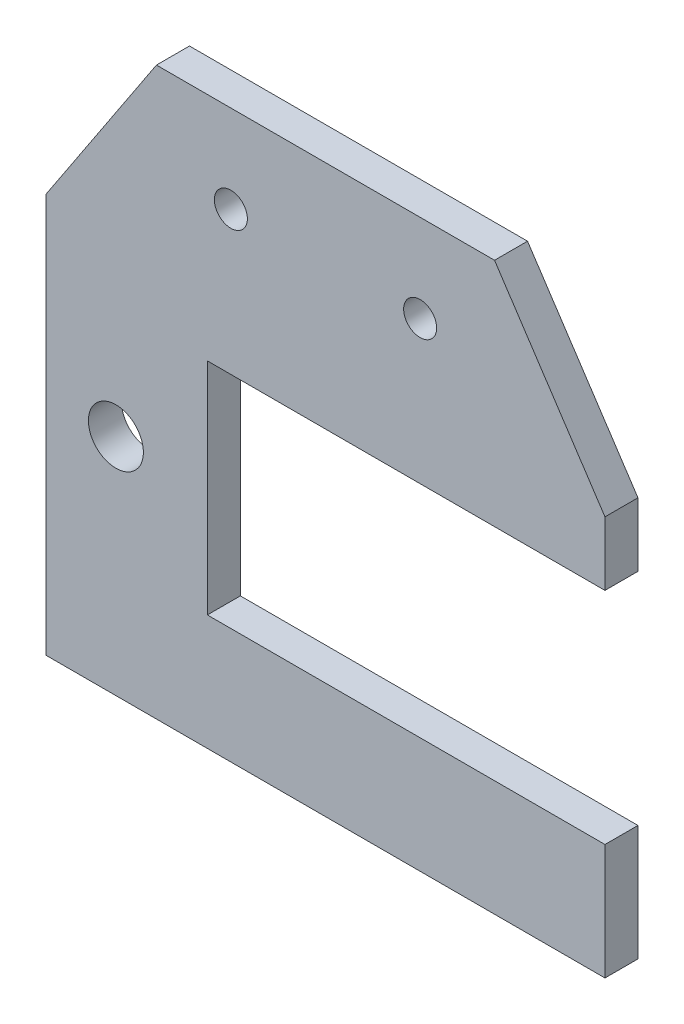
ISO-10303-21;
HEADER;
FILE_DESCRIPTION(('STEP AP214'),'2;1');
FILE_NAME('part.step','',(''),(''),'','','');
FILE_SCHEMA(('AUTOMOTIVE_DESIGN { 1 0 10303 214 1 1 1 1 }'));
ENDSEC;
DATA;
#1=APPLICATION_CONTEXT('core data for automotive mechanical design processes');
#2=APPLICATION_PROTOCOL_DEFINITION('international standard','automotive_design',2000,#1);
#3=PRODUCT_CONTEXT('',#1,'mechanical');
#4=PRODUCT('Part','Part','',(#3));
#5=PRODUCT_RELATED_PRODUCT_CATEGORY('part','',(#4));
#6=PRODUCT_DEFINITION_FORMATION('','',#4);
#7=PRODUCT_DEFINITION_CONTEXT('part definition',#1,'design');
#8=PRODUCT_DEFINITION('design','',#6,#7);
#9=PRODUCT_DEFINITION_SHAPE('','',#8);
#10=(LENGTH_UNIT() NAMED_UNIT(*) SI_UNIT(.MILLI.,.METRE.));
#11=(NAMED_UNIT(*) PLANE_ANGLE_UNIT() SI_UNIT($,.RADIAN.));
#12=(NAMED_UNIT(*) SI_UNIT($,.STERADIAN.) SOLID_ANGLE_UNIT());
#13=UNCERTAINTY_MEASURE_WITH_UNIT(LENGTH_MEASURE(1.E-05),#10,'distance_accuracy_value','');
#14=(GEOMETRIC_REPRESENTATION_CONTEXT(3) GLOBAL_UNCERTAINTY_ASSIGNED_CONTEXT((#13)) GLOBAL_UNIT_ASSIGNED_CONTEXT((#10,
#11,#12)) REPRESENTATION_CONTEXT('',''));
#15=CARTESIAN_POINT('',(0.,0.,0.));
#16=DIRECTION('',(0.,0.,1.));
#17=DIRECTION('',(1.,0.,0.));
#18=AXIS2_PLACEMENT_3D('',#15,#16,#17);
#19=CARTESIAN_POINT('',(0.,-1.81128409951094,3.));
#20=DIRECTION('',(0.,1.,0.));
#21=DIRECTION('',(-1.,0.,0.));
#22=AXIS2_PLACEMENT_3D('',#19,#20,#21);
#23=PLANE('',#22);
#24=DIRECTION('',(1.,0.,0.));
#25=VECTOR('',#24,1.);
#26=CARTESIAN_POINT('',(0.,-1.81128409951094,0.));
#27=LINE('',#26,#25);
#28=CARTESIAN_POINT('',(-10.7376947569757,-1.81128409951094,0.));
#29=VERTEX_POINT('',#28);
#30=CARTESIAN_POINT('',(25.4023052430243,-1.81128409951094,0.));
#31=VERTEX_POINT('',#30);
#32=EDGE_CURVE('E196',#29,#31,#27,.T.);
#33=ORIENTED_EDGE('',*,*,#32,.F.);
#34=DIRECTION('',(0.,0.,-1.));
#35=VECTOR('',#34,1.);
#36=CARTESIAN_POINT('',(-10.7376947569757,-1.81128409951094,3.));
#37=LINE('',#36,#35);
#38=CARTESIAN_POINT('',(-10.7376947569757,-1.81128409951094,3.));
#39=VERTEX_POINT('',#38);
#40=EDGE_CURVE('E11',#39,#29,#37,.T.);
#41=ORIENTED_EDGE('',*,*,#40,.F.);
#42=DIRECTION('',(1.,0.,0.));
#43=VECTOR('',#42,1.);
#44=CARTESIAN_POINT('',(0.,-1.81128409951094,3.));
#45=LINE('',#44,#43);
#46=CARTESIAN_POINT('',(25.4023052430243,-1.81128409951094,3.));
#47=VERTEX_POINT('',#46);
#48=EDGE_CURVE('E307',#39,#47,#45,.T.);
#49=ORIENTED_EDGE('',*,*,#48,.T.);
#50=DIRECTION('',(0.,0.,-1.));
#51=VECTOR('',#50,1.);
#52=CARTESIAN_POINT('',(25.4023052430243,-1.81128409951094,3.));
#53=LINE('',#52,#51);
#54=EDGE_CURVE('E61',#47,#31,#53,.T.);
#55=ORIENTED_EDGE('',*,*,#54,.T.);
#56=EDGE_LOOP('',(#33,#41,#49,#55));
#57=FACE_BOUND('',#56,.T.);
#58=ADVANCED_FACE('F43',(#57),#23,.T.);
#59=CARTESIAN_POINT('',(-10.7376947569757,0.,3.));
#60=DIRECTION('',(1.,0.,0.));
#61=DIRECTION('',(0.,1.,0.));
#62=AXIS2_PLACEMENT_3D('',#59,#60,#61);
#63=PLANE('',#62);
#64=DIRECTION('',(0.,-1.,0.));
#65=VECTOR('',#64,1.);
#66=CARTESIAN_POINT('',(-10.7376947569757,0.,0.));
#67=LINE('',#66,#65);
#68=CARTESIAN_POINT('',(-10.7376947569757,18.1887159004891,0.));
#69=VERTEX_POINT('',#68);
#70=EDGE_CURVE('E188',#69,#29,#67,.T.);
#71=ORIENTED_EDGE('',*,*,#70,.F.);
#72=DIRECTION('',(0.,0.,-1.));
#73=VECTOR('',#72,1.);
#74=CARTESIAN_POINT('',(-10.7376947569757,18.1887159004891,3.));
#75=LINE('',#74,#73);
#76=CARTESIAN_POINT('',(-10.7376947569757,18.1887159004891,3.));
#77=VERTEX_POINT('',#76);
#78=EDGE_CURVE('E53',#77,#69,#75,.T.);
#79=ORIENTED_EDGE('',*,*,#78,.F.);
#80=DIRECTION('',(0.,-1.,0.));
#81=VECTOR('',#80,1.);
#82=CARTESIAN_POINT('',(-10.7376947569757,0.,3.));
#83=LINE('',#82,#81);
#84=EDGE_CURVE('E312',#77,#39,#83,.T.);
#85=ORIENTED_EDGE('',*,*,#84,.T.);
#86=ORIENTED_EDGE('',*,*,#40,.T.);
#87=EDGE_LOOP('',(#71,#79,#85,#86));
#88=FACE_BOUND('',#87,.T.);
#89=ADVANCED_FACE('F194',(#88),#63,.T.);
#90=CARTESIAN_POINT('',(0.,18.1887159004891,3.));
#91=DIRECTION('',(0.,1.,0.));
#92=DIRECTION('',(-1.,0.,0.));
#93=AXIS2_PLACEMENT_3D('',#90,#91,#92);
#94=PLANE('',#93);
#95=DIRECTION('',(1.,0.,0.));
#96=VECTOR('',#95,1.);
#97=CARTESIAN_POINT('',(0.,18.1887159004891,0.));
#98=LINE('',#97,#96);
#99=CARTESIAN_POINT('',(25.4023052430243,18.1887159004891,0.));
#100=VERTEX_POINT('',#99);
#101=EDGE_CURVE('E177',#69,#100,#98,.T.);
#102=ORIENTED_EDGE('',*,*,#101,.T.);
#103=DIRECTION('',(0.,0.,-1.));
#104=VECTOR('',#103,1.);
#105=CARTESIAN_POINT('',(25.4023052430243,18.1887159004891,3.));
#106=LINE('',#105,#104);
#107=CARTESIAN_POINT('',(25.4023052430243,18.1887159004891,3.));
#108=VERTEX_POINT('',#107);
#109=EDGE_CURVE('E167',#108,#100,#106,.T.);
#110=ORIENTED_EDGE('',*,*,#109,.F.);
#111=DIRECTION('',(1.,0.,0.));
#112=VECTOR('',#111,1.);
#113=CARTESIAN_POINT('',(0.,18.1887159004891,3.));
#114=LINE('',#113,#112);
#115=EDGE_CURVE('E179',#77,#108,#114,.T.);
#116=ORIENTED_EDGE('',*,*,#115,.F.);
#117=ORIENTED_EDGE('',*,*,#78,.T.);
#118=EDGE_LOOP('',(#102,#110,#116,#117));
#119=FACE_BOUND('',#118,.T.);
#120=ADVANCED_FACE('F175',(#119),#94,.F.);
#121=CARTESIAN_POINT('',(25.4023052430243,0.,3.));
#122=DIRECTION('',(1.,0.,0.));
#123=DIRECTION('',(0.,1.,0.));
#124=AXIS2_PLACEMENT_3D('',#121,#122,#123);
#125=PLANE('',#124);
#126=DIRECTION('',(0.,-1.,0.));
#127=VECTOR('',#126,1.);
#128=CARTESIAN_POINT('',(25.4023052430243,0.,0.));
#129=LINE('',#128,#127);
#130=CARTESIAN_POINT('',(25.4023052430243,23.9787159004891,0.));
#131=VERTEX_POINT('',#130);
#132=EDGE_CURVE('E191',#131,#100,#129,.T.);
#133=ORIENTED_EDGE('',*,*,#132,.F.);
#134=DIRECTION('',(0.,0.,-1.));
#135=VECTOR('',#134,1.);
#136=CARTESIAN_POINT('',(25.4023052430243,23.9787159004891,3.));
#137=LINE('',#136,#135);
#138=CARTESIAN_POINT('',(25.4023052430243,23.9787159004891,3.));
#139=VERTEX_POINT('',#138);
#140=EDGE_CURVE('E164',#139,#131,#137,.T.);
#141=ORIENTED_EDGE('',*,*,#140,.F.);
#142=DIRECTION('',(0.,-1.,0.));
#143=VECTOR('',#142,1.);
#144=CARTESIAN_POINT('',(25.4023052430243,0.,3.));
#145=LINE('',#144,#143);
#146=EDGE_CURVE('E320',#139,#108,#145,.T.);
#147=ORIENTED_EDGE('',*,*,#146,.T.);
#148=ORIENTED_EDGE('',*,*,#109,.T.);
#149=EDGE_LOOP('',(#133,#141,#147,#148));
#150=FACE_BOUND('',#149,.T.);
#151=ADVANCED_FACE('F272',(#150),#125,.T.);
#152=CARTESIAN_POINT('',(28.7074792914118,18.9794572707475,3.));
#153=DIRECTION('',(0.834174701276416,0.551500288078259,0.));
#154=DIRECTION('',(-0.551500288078259,0.834174701276416,0.));
#155=AXIS2_PLACEMENT_3D('',#152,#153,#154);
#156=PLANE('',#155);
#157=DIRECTION('',(0.551500288078259,-0.834174701276416,0.));
#158=VECTOR('',#157,1.);
#159=CARTESIAN_POINT('',(28.7074792914118,18.9794572707475,0.));
#160=LINE('',#159,#158);
#161=CARTESIAN_POINT('',(15.365,39.1606954637198,0.));
#162=VERTEX_POINT('',#161);
#163=EDGE_CURVE('E206',#162,#131,#160,.T.);
#164=ORIENTED_EDGE('',*,*,#163,.F.);
#165=DIRECTION('',(0.,0.,-1.));
#166=VECTOR('',#165,1.);
#167=CARTESIAN_POINT('',(15.365,39.1606954637198,3.));
#168=LINE('',#167,#166);
#169=CARTESIAN_POINT('',(15.365,39.1606954637198,3.));
#170=VERTEX_POINT('',#169);
#171=EDGE_CURVE('E161',#170,#162,#168,.T.);
#172=ORIENTED_EDGE('',*,*,#171,.F.);
#173=DIRECTION('',(0.551500288078259,-0.834174701276416,0.));
#174=VECTOR('',#173,1.);
#175=CARTESIAN_POINT('',(28.7074792914118,18.9794572707475,3.));
#176=LINE('',#175,#174);
#177=EDGE_CURVE('E324',#170,#139,#176,.T.);
#178=ORIENTED_EDGE('',*,*,#177,.T.);
#179=ORIENTED_EDGE('',*,*,#140,.T.);
#180=EDGE_LOOP('',(#164,#172,#178,#179));
#181=FACE_BOUND('',#180,.T.);
#182=ADVANCED_FACE('F275',(#181),#156,.T.);
#183=CARTESIAN_POINT('',(0.,39.1606954637198,3.));
#184=DIRECTION('',(0.,-1.,0.));
#185=DIRECTION('',(0.,0.,-1.));
#186=AXIS2_PLACEMENT_3D('',#183,#184,#185);
#187=PLANE('',#186);
#188=DIRECTION('',(-1.,0.,0.));
#189=VECTOR('',#188,1.);
#190=CARTESIAN_POINT('',(0.,39.1606954637198,0.));
#191=LINE('',#190,#189);
#192=CARTESIAN_POINT('',(-15.365,39.1606954637198,0.));
#193=VERTEX_POINT('',#192);
#194=EDGE_CURVE('E209',#162,#193,#191,.T.);
#195=ORIENTED_EDGE('',*,*,#194,.T.);
#196=DIRECTION('',(0.,0.,-1.));
#197=VECTOR('',#196,1.);
#198=CARTESIAN_POINT('',(-15.365,39.1606954637198,3.));
#199=LINE('',#198,#197);
#200=CARTESIAN_POINT('',(-15.365,39.1606954637198,3.));
#201=VERTEX_POINT('',#200);
#202=EDGE_CURVE('E153',#201,#193,#199,.T.);
#203=ORIENTED_EDGE('',*,*,#202,.F.);
#204=DIRECTION('',(-1.,0.,0.));
#205=VECTOR('',#204,1.);
#206=CARTESIAN_POINT('',(0.,39.1606954637198,3.));
#207=LINE('',#206,#205);
#208=EDGE_CURVE('E328',#170,#201,#207,.T.);
#209=ORIENTED_EDGE('',*,*,#208,.F.);
#210=ORIENTED_EDGE('',*,*,#171,.T.);
#211=EDGE_LOOP('',(#195,#203,#209,#210));
#212=FACE_BOUND('',#211,.T.);
#213=ADVANCED_FACE('F279',(#212),#187,.F.);
#214=CARTESIAN_POINT('',(-28.7074792914118,18.9794572707475,3.));
#215=DIRECTION('',(0.834174701276416,-0.551500288078259,0.));
#216=DIRECTION('',(0.551500288078259,0.834174701276416,0.));
#217=AXIS2_PLACEMENT_3D('',#214,#215,#216);
#218=PLANE('',#217);
#219=DIRECTION('',(-0.551500288078259,-0.834174701276416,0.));
#220=VECTOR('',#219,1.);
#221=CARTESIAN_POINT('',(-28.7074792914118,18.9794572707475,0.));
#222=LINE('',#221,#220);
#223=CARTESIAN_POINT('',(-25.4023052430243,23.9787159004891,0.));
#224=VERTEX_POINT('',#223);
#225=EDGE_CURVE('E213',#193,#224,#222,.T.);
#226=ORIENTED_EDGE('',*,*,#225,.T.);
#227=DIRECTION('',(0.,0.,-1.));
#228=VECTOR('',#227,1.);
#229=CARTESIAN_POINT('',(-25.4023052430243,23.9787159004891,3.));
#230=LINE('',#229,#228);
#231=CARTESIAN_POINT('',(-25.4023052430243,23.9787159004891,3.));
#232=VERTEX_POINT('',#231);
#233=EDGE_CURVE('E148',#232,#224,#230,.T.);
#234=ORIENTED_EDGE('',*,*,#233,.F.);
#235=DIRECTION('',(-0.551500288078259,-0.834174701276416,0.));
#236=VECTOR('',#235,1.);
#237=CARTESIAN_POINT('',(-28.7074792914118,18.9794572707475,3.));
#238=LINE('',#237,#236);
#239=EDGE_CURVE('E139',#201,#232,#238,.T.);
#240=ORIENTED_EDGE('',*,*,#239,.F.);
#241=ORIENTED_EDGE('',*,*,#202,.T.);
#242=EDGE_LOOP('',(#226,#234,#240,#241));
#243=FACE_BOUND('',#242,.T.);
#244=ADVANCED_FACE('F283',(#243),#218,.F.);
#245=CARTESIAN_POINT('',(-25.4023052430243,0.,3.));
#246=DIRECTION('',(1.,0.,0.));
#247=DIRECTION('',(0.,1.,0.));
#248=AXIS2_PLACEMENT_3D('',#245,#246,#247);
#249=PLANE('',#248);
#250=DIRECTION('',(0.,-1.,0.));
#251=VECTOR('',#250,1.);
#252=CARTESIAN_POINT('',(-25.4023052430243,0.,0.));
#253=LINE('',#252,#251);
#254=CARTESIAN_POINT('',(-25.4023052430243,-12.3212840995111,0.));
#255=VERTEX_POINT('',#254);
#256=EDGE_CURVE('E146',#224,#255,#253,.T.);
#257=ORIENTED_EDGE('',*,*,#256,.T.);
#258=DIRECTION('',(0.,0.,-1.));
#259=VECTOR('',#258,1.);
#260=CARTESIAN_POINT('',(-25.4023052430243,-12.3212840995111,3.));
#261=LINE('',#260,#259);
#262=CARTESIAN_POINT('',(-25.4023052430243,-12.3212840995111,3.));
#263=VERTEX_POINT('',#262);
#264=EDGE_CURVE('E127',#263,#255,#261,.T.);
#265=ORIENTED_EDGE('',*,*,#264,.F.);
#266=DIRECTION('',(0.,-1.,0.));
#267=VECTOR('',#266,1.);
#268=CARTESIAN_POINT('',(-25.4023052430243,0.,3.));
#269=LINE('',#268,#267);
#270=EDGE_CURVE('E133',#232,#263,#269,.T.);
#271=ORIENTED_EDGE('',*,*,#270,.F.);
#272=ORIENTED_EDGE('',*,*,#233,.T.);
#273=EDGE_LOOP('',(#257,#265,#271,#272));
#274=FACE_BOUND('',#273,.T.);
#275=ADVANCED_FACE('F145',(#274),#249,.F.);
#276=CARTESIAN_POINT('',(0.,-12.321284099511,3.));
#277=DIRECTION('',(0.,1.,0.));
#278=DIRECTION('',(-1.,0.,0.));
#279=AXIS2_PLACEMENT_3D('',#276,#277,#278);
#280=PLANE('',#279);
#281=DIRECTION('',(1.,0.,0.));
#282=VECTOR('',#281,1.);
#283=CARTESIAN_POINT('',(0.,-12.321284099511,0.));
#284=LINE('',#283,#282);
#285=CARTESIAN_POINT('',(25.4023052430243,-12.3212840995109,0.));
#286=VERTEX_POINT('',#285);
#287=EDGE_CURVE('E219',#255,#286,#284,.T.);
#288=ORIENTED_EDGE('',*,*,#287,.T.);
#289=DIRECTION('',(0.,0.,-1.));
#290=VECTOR('',#289,1.);
#291=CARTESIAN_POINT('',(25.4023052430243,-12.3212840995109,3.));
#292=LINE('',#291,#290);
#293=CARTESIAN_POINT('',(25.4023052430243,-12.3212840995109,3.));
#294=VERTEX_POINT('',#293);
#295=EDGE_CURVE('E93',#294,#286,#292,.T.);
#296=ORIENTED_EDGE('',*,*,#295,.F.);
#297=DIRECTION('',(1.,0.,0.));
#298=VECTOR('',#297,1.);
#299=CARTESIAN_POINT('',(0.,-12.321284099511,3.));
#300=LINE('',#299,#298);
#301=EDGE_CURVE('E123',#263,#294,#300,.T.);
#302=ORIENTED_EDGE('',*,*,#301,.F.);
#303=ORIENTED_EDGE('',*,*,#264,.T.);
#304=EDGE_LOOP('',(#288,#296,#302,#303));
#305=FACE_BOUND('',#304,.T.);
#306=ADVANCED_FACE('F125',(#305),#280,.F.);
#307=CARTESIAN_POINT('',(25.4023052430243,0.,3.));
#308=DIRECTION('',(1.,0.,0.));
#309=DIRECTION('',(0.,1.,0.));
#310=AXIS2_PLACEMENT_3D('',#307,#308,#309);
#311=PLANE('',#310);
#312=DIRECTION('',(0.,-1.,0.));
#313=VECTOR('',#312,1.);
#314=CARTESIAN_POINT('',(25.4023052430243,0.,0.));
#315=LINE('',#314,#313);
#316=EDGE_CURVE('E222',#31,#286,#315,.T.);
#317=ORIENTED_EDGE('',*,*,#316,.F.);
#318=ORIENTED_EDGE('',*,*,#54,.F.);
#319=DIRECTION('',(0.,-1.,0.));
#320=VECTOR('',#319,1.);
#321=CARTESIAN_POINT('',(25.4023052430243,0.,3.));
#322=LINE('',#321,#320);
#323=EDGE_CURVE('E132',#47,#294,#322,.T.);
#324=ORIENTED_EDGE('',*,*,#323,.T.);
#325=ORIENTED_EDGE('',*,*,#295,.T.);
#326=EDGE_LOOP('',(#317,#318,#324,#325));
#327=FACE_BOUND('',#326,.T.);
#328=ADVANCED_FACE('F253',(#327),#311,.T.);
#329=CARTESIAN_POINT('',(-19.0523052430243,8.07871590048893,3.));
#330=DIRECTION('',(0.,0.,-1.));
#331=DIRECTION('',(-1.,0.,0.));
#332=AXIS2_PLACEMENT_3D('',#329,#330,#331);
#333=CYLINDRICAL_SURFACE('',#332,2.5);
#334=CARTESIAN_POINT('',(-19.0523052430243,8.07871590048893,3.));
#335=DIRECTION('',(0.,0.,1.));
#336=DIRECTION('',(1.,0.,0.));
#337=AXIS2_PLACEMENT_3D('',#334,#335,#336);
#338=CIRCLE('',#337,2.5);
#339=CARTESIAN_POINT('',(-16.5523052430243,8.07871590048893,3.));
#340=VERTEX_POINT('',#339);
#341=EDGE_CURVE('E305',#340,#340,#338,.T.);
#342=ORIENTED_EDGE('',*,*,#341,.T.);
#343=EDGE_LOOP('',(#342));
#344=FACE_BOUND('',#343,.T.);
#345=CARTESIAN_POINT('',(-19.0523052430243,8.07871590048893,0.));
#346=DIRECTION('',(0.,0.,1.));
#347=DIRECTION('',(1.,0.,0.));
#348=AXIS2_PLACEMENT_3D('',#345,#346,#347);
#349=CIRCLE('',#348,2.5);
#350=CARTESIAN_POINT('',(-16.5523052430243,8.07871590048893,0.));
#351=VERTEX_POINT('',#350);
#352=EDGE_CURVE('E200',#351,#351,#349,.T.);
#353=ORIENTED_EDGE('',*,*,#352,.F.);
#354=EDGE_LOOP('',(#353));
#355=FACE_BOUND('',#354,.T.);
#356=ADVANCED_FACE('F251',(#344,#355),#333,.F.);
#357=CARTESIAN_POINT('',(-8.60230524302431,31.1906954637198,3.));
#358=DIRECTION('',(0.,0.,-1.));
#359=DIRECTION('',(-1.,0.,0.));
#360=AXIS2_PLACEMENT_3D('',#357,#358,#359);
#361=CYLINDRICAL_SURFACE('',#360,1.5);
#362=CARTESIAN_POINT('',(-8.60230524302431,31.1906954637198,3.));
#363=DIRECTION('',(0.,0.,1.));
#364=DIRECTION('',(1.,0.,0.));
#365=AXIS2_PLACEMENT_3D('',#362,#363,#364);
#366=CIRCLE('',#365,1.5);
#367=CARTESIAN_POINT('',(-7.10230524302431,31.1906954637198,3.));
#368=VERTEX_POINT('',#367);
#369=EDGE_CURVE('E229',#368,#368,#366,.T.);
#370=ORIENTED_EDGE('',*,*,#369,.T.);
#371=EDGE_LOOP('',(#370));
#372=FACE_BOUND('',#371,.T.);
#373=CARTESIAN_POINT('',(-8.60230524302431,31.1906954637198,0.));
#374=DIRECTION('',(0.,0.,1.));
#375=DIRECTION('',(1.,0.,0.));
#376=AXIS2_PLACEMENT_3D('',#373,#374,#375);
#377=CIRCLE('',#376,1.5);
#378=CARTESIAN_POINT('',(-7.10230524302431,31.1906954637198,0.));
#379=VERTEX_POINT('',#378);
#380=EDGE_CURVE('E242',#379,#379,#377,.T.);
#381=ORIENTED_EDGE('',*,*,#380,.F.);
#382=EDGE_LOOP('',(#381));
#383=FACE_BOUND('',#382,.T.);
#384=ADVANCED_FACE('F45',(#372,#383),#361,.F.);
#385=CARTESIAN_POINT('',(8.60230524302432,31.1906954637198,3.));
#386=DIRECTION('',(0.,0.,-1.));
#387=DIRECTION('',(-1.,0.,0.));
#388=AXIS2_PLACEMENT_3D('',#385,#386,#387);
#389=CYLINDRICAL_SURFACE('',#388,1.5);
#390=CARTESIAN_POINT('',(8.60230524302432,31.1906954637198,3.));
#391=DIRECTION('',(0.,0.,1.));
#392=DIRECTION('',(1.,0.,0.));
#393=AXIS2_PLACEMENT_3D('',#390,#391,#392);
#394=CIRCLE('',#393,1.5);
#395=CARTESIAN_POINT('',(10.1023052430243,31.1906954637198,3.));
#396=VERTEX_POINT('',#395);
#397=EDGE_CURVE('E231',#396,#396,#394,.T.);
#398=ORIENTED_EDGE('',*,*,#397,.T.);
#399=EDGE_LOOP('',(#398));
#400=FACE_BOUND('',#399,.T.);
#401=CARTESIAN_POINT('',(8.60230524302432,31.1906954637198,0.));
#402=DIRECTION('',(0.,0.,1.));
#403=DIRECTION('',(1.,0.,0.));
#404=AXIS2_PLACEMENT_3D('',#401,#402,#403);
#405=CIRCLE('',#404,1.5);
#406=CARTESIAN_POINT('',(10.1023052430243,31.1906954637198,0.));
#407=VERTEX_POINT('',#406);
#408=EDGE_CURVE('E226',#407,#407,#405,.T.);
#409=ORIENTED_EDGE('',*,*,#408,.F.);
#410=EDGE_LOOP('',(#409));
#411=FACE_BOUND('',#410,.T.);
#412=ADVANCED_FACE('F259',(#400,#411),#389,.F.);
#413=CARTESIAN_POINT('',(0.,0.,3.));
#414=DIRECTION('',(0.,0.,1.));
#415=DIRECTION('',(1.,0.,0.));
#416=AXIS2_PLACEMENT_3D('',#413,#414,#415);
#417=PLANE('',#416);
#418=ORIENTED_EDGE('',*,*,#369,.F.);
#419=EDGE_LOOP('',(#418));
#420=FACE_BOUND('',#419,.T.);
#421=ORIENTED_EDGE('',*,*,#341,.F.);
#422=EDGE_LOOP('',(#421));
#423=FACE_BOUND('',#422,.T.);
#424=ORIENTED_EDGE('',*,*,#48,.F.);
#425=ORIENTED_EDGE('',*,*,#84,.F.);
#426=ORIENTED_EDGE('',*,*,#115,.T.);
#427=ORIENTED_EDGE('',*,*,#146,.F.);
#428=ORIENTED_EDGE('',*,*,#177,.F.);
#429=ORIENTED_EDGE('',*,*,#208,.T.);
#430=ORIENTED_EDGE('',*,*,#239,.T.);
#431=ORIENTED_EDGE('',*,*,#270,.T.);
#432=ORIENTED_EDGE('',*,*,#301,.T.);
#433=ORIENTED_EDGE('',*,*,#323,.F.);
#434=EDGE_LOOP('',(#424,#425,#426,#427,#428,#429,#430,#431,#432,#433));
#435=FACE_BOUND('',#434,.T.);
#436=ORIENTED_EDGE('',*,*,#397,.F.);
#437=EDGE_LOOP('',(#436));
#438=FACE_BOUND('',#437,.T.);
#439=ADVANCED_FACE('F136',(#420,#423,#435,#438),#417,.T.);
#440=CARTESIAN_POINT('',(0.,0.,0.));
#441=DIRECTION('',(0.,0.,1.));
#442=DIRECTION('',(1.,0.,0.));
#443=AXIS2_PLACEMENT_3D('',#440,#441,#442);
#444=PLANE('',#443);
#445=ORIENTED_EDGE('',*,*,#380,.T.);
#446=EDGE_LOOP('',(#445));
#447=FACE_BOUND('',#446,.T.);
#448=ORIENTED_EDGE('',*,*,#352,.T.);
#449=EDGE_LOOP('',(#448));
#450=FACE_BOUND('',#449,.T.);
#451=ORIENTED_EDGE('',*,*,#32,.T.);
#452=ORIENTED_EDGE('',*,*,#316,.T.);
#453=ORIENTED_EDGE('',*,*,#287,.F.);
#454=ORIENTED_EDGE('',*,*,#256,.F.);
#455=ORIENTED_EDGE('',*,*,#225,.F.);
#456=ORIENTED_EDGE('',*,*,#194,.F.);
#457=ORIENTED_EDGE('',*,*,#163,.T.);
#458=ORIENTED_EDGE('',*,*,#132,.T.);
#459=ORIENTED_EDGE('',*,*,#101,.F.);
#460=ORIENTED_EDGE('',*,*,#70,.T.);
#461=EDGE_LOOP('',(#451,#452,#453,#454,#455,#456,#457,#458,#459,#460));
#462=FACE_BOUND('',#461,.T.);
#463=ORIENTED_EDGE('',*,*,#408,.T.);
#464=EDGE_LOOP('',(#463));
#465=FACE_BOUND('',#464,.T.);
#466=ADVANCED_FACE('F186',(#447,#450,#462,#465),#444,.F.);
#467=CLOSED_SHELL('',(#58,#89,#120,#151,#182,#213,#244,#275,#306,#328,#356,#384,#412,#439,#466));
#468=MANIFOLD_SOLID_BREP('B2',#467);
#469=ADVANCED_BREP_SHAPE_REPRESENTATION('',(#18,#468),#14);
#470=SHAPE_DEFINITION_REPRESENTATION(#9,#469);
ENDSEC;
END-ISO-10303-21;
